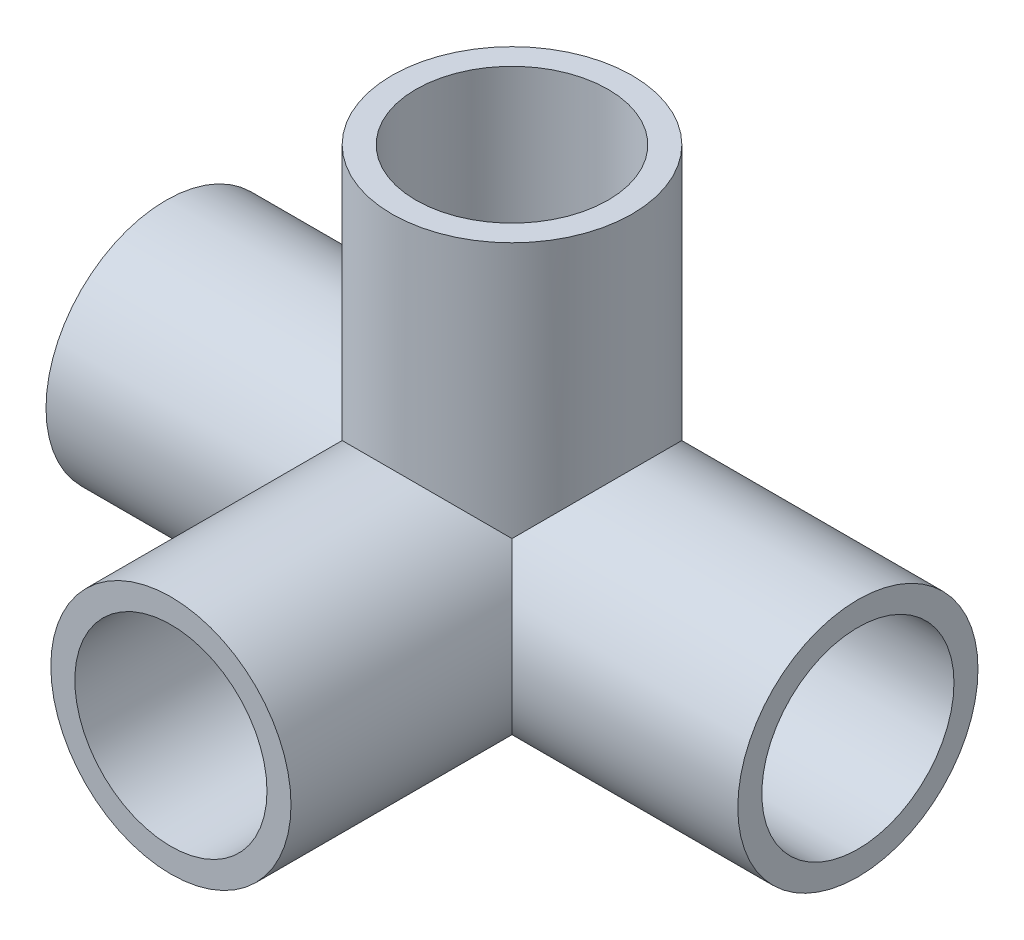
ISO-10303-21;
HEADER;
FILE_DESCRIPTION(('STEP AP214'),'2;1');
FILE_NAME('part.step','',(''),(''),'','','');
FILE_SCHEMA(('AUTOMOTIVE_DESIGN { 1 0 10303 214 1 1 1 1 }'));
ENDSEC;
DATA;
#1=APPLICATION_CONTEXT('core data for automotive mechanical design processes');
#2=APPLICATION_PROTOCOL_DEFINITION('international standard','automotive_design',2000,#1);
#3=PRODUCT_CONTEXT('',#1,'mechanical');
#4=PRODUCT('Part','Part','',(#3));
#5=PRODUCT_RELATED_PRODUCT_CATEGORY('part','',(#4));
#6=PRODUCT_DEFINITION_FORMATION('','',#4);
#7=PRODUCT_DEFINITION_CONTEXT('part definition',#1,'design');
#8=PRODUCT_DEFINITION('design','',#6,#7);
#9=PRODUCT_DEFINITION_SHAPE('','',#8);
#10=(LENGTH_UNIT() NAMED_UNIT(*) SI_UNIT(.MILLI.,.METRE.));
#11=(NAMED_UNIT(*) PLANE_ANGLE_UNIT() SI_UNIT($,.RADIAN.));
#12=(NAMED_UNIT(*) SI_UNIT($,.STERADIAN.) SOLID_ANGLE_UNIT());
#13=UNCERTAINTY_MEASURE_WITH_UNIT(LENGTH_MEASURE(1.E-05),#10,'distance_accuracy_value','');
#14=(GEOMETRIC_REPRESENTATION_CONTEXT(3) GLOBAL_UNCERTAINTY_ASSIGNED_CONTEXT((#13)) GLOBAL_UNIT_ASSIGNED_CONTEXT((#10,
#11,#12)) REPRESENTATION_CONTEXT('',''));
#15=CARTESIAN_POINT('',(0.,0.,0.));
#16=DIRECTION('',(0.,0.,1.));
#17=DIRECTION('',(1.,0.,0.));
#18=AXIS2_PLACEMENT_3D('',#15,#16,#17);
#19=CARTESIAN_POINT('',(36.,0.,0.));
#20=DIRECTION('',(-1.,0.,0.));
#21=DIRECTION('',(0.,0.,1.));
#22=AXIS2_PLACEMENT_3D('',#19,#20,#21);
#23=CYLINDRICAL_SURFACE('',#22,12.5);
#24=CARTESIAN_POINT('',(36.,0.,0.));
#25=DIRECTION('',(1.,0.,0.));
#26=DIRECTION('',(0.,0.,-1.));
#27=AXIS2_PLACEMENT_3D('',#24,#25,#26);
#28=CIRCLE('',#27,12.5);
#29=CARTESIAN_POINT('',(36.,0.,-12.5));
#30=VERTEX_POINT('',#29);
#31=EDGE_CURVE('E102',#30,#30,#28,.T.);
#32=ORIENTED_EDGE('',*,*,#31,.F.);
#33=EDGE_LOOP('',(#32));
#34=FACE_BOUND('',#33,.T.);
#35=CARTESIAN_POINT('',(-36.,0.,0.));
#36=DIRECTION('',(1.,0.,0.));
#37=DIRECTION('',(0.,0.,-1.));
#38=AXIS2_PLACEMENT_3D('',#35,#36,#37);
#39=CIRCLE('',#38,12.5);
#40=CARTESIAN_POINT('',(-36.,0.,-12.5));
#41=VERTEX_POINT('',#40);
#42=EDGE_CURVE('E106',#41,#41,#39,.T.);
#43=ORIENTED_EDGE('',*,*,#42,.T.);
#44=EDGE_LOOP('',(#43));
#45=FACE_BOUND('',#44,.T.);
#46=CARTESIAN_POINT('',(0.,0.,0.));
#47=DIRECTION('',(-0.707106781186547,0.,-0.707106781186547));
#48=DIRECTION('',(-0.707106781186547,0.,0.707106781186547));
#49=AXIS2_PLACEMENT_3D('',#46,#47,#48);
#50=ELLIPSE('',#49,17.6776695296637,12.5);
#51=CARTESIAN_POINT('',(-8.83883476483184,8.83883476483184,8.83883476483184));
#52=VERTEX_POINT('',#51);
#53=CARTESIAN_POINT('',(0.,-12.5,0.));
#54=VERTEX_POINT('',#53);
#55=EDGE_CURVE('E96',#52,#54,#50,.F.);
#56=ORIENTED_EDGE('',*,*,#55,.F.);
#57=CARTESIAN_POINT('',(0.,0.,0.));
#58=DIRECTION('',(-0.707106781186547,-0.707106781186547,0.));
#59=DIRECTION('',(-0.707106781186547,0.707106781186547,0.));
#60=AXIS2_PLACEMENT_3D('',#57,#58,#59);
#61=ELLIPSE('',#60,17.6776695296637,12.5);
#62=CARTESIAN_POINT('',(0.,0.,-12.5));
#63=VERTEX_POINT('',#62);
#64=EDGE_CURVE('E44',#63,#52,#61,.F.);
#65=ORIENTED_EDGE('',*,*,#64,.F.);
#66=CARTESIAN_POINT('',(0.,0.,0.));
#67=DIRECTION('',(-0.707106781186547,0.707106781186547,0.));
#68=DIRECTION('',(-0.707106781186547,-0.707106781186547,0.));
#69=AXIS2_PLACEMENT_3D('',#66,#67,#68);
#70=ELLIPSE('',#69,17.6776695296637,12.5);
#71=CARTESIAN_POINT('',(8.83883476483184,8.83883476483184,8.83883476483184));
#72=VERTEX_POINT('',#71);
#73=EDGE_CURVE('E100',#72,#63,#70,.T.);
#74=ORIENTED_EDGE('',*,*,#73,.F.);
#75=CARTESIAN_POINT('',(0.,0.,0.));
#76=DIRECTION('',(-0.707106781186547,0.,0.707106781186547));
#77=DIRECTION('',(-0.707106781186547,0.,-0.707106781186547));
#78=AXIS2_PLACEMENT_3D('',#75,#76,#77);
#79=ELLIPSE('',#78,17.6776695296637,12.5);
#80=EDGE_CURVE('E51',#54,#72,#79,.T.);
#81=ORIENTED_EDGE('',*,*,#80,.F.);
#82=EDGE_LOOP('',(#56,#65,#74,#81));
#83=FACE_BOUND('',#82,.T.);
#84=ADVANCED_FACE('F34',(#34,#45,#83),#23,.T.);
#85=CARTESIAN_POINT('',(0.,35.5,0.));
#86=DIRECTION('',(0.,-1.,0.));
#87=DIRECTION('',(0.,0.,-1.));
#88=AXIS2_PLACEMENT_3D('',#85,#86,#87);
#89=CYLINDRICAL_SURFACE('',#88,12.5);
#90=CARTESIAN_POINT('',(0.,35.5,0.));
#91=DIRECTION('',(0.,1.,0.));
#92=DIRECTION('',(0.,0.,1.));
#93=AXIS2_PLACEMENT_3D('',#90,#91,#92);
#94=CIRCLE('',#93,12.5);
#95=CARTESIAN_POINT('',(0.,35.5,12.5));
#96=VERTEX_POINT('',#95);
#97=EDGE_CURVE('E98',#96,#96,#94,.T.);
#98=ORIENTED_EDGE('',*,*,#97,.F.);
#99=EDGE_LOOP('',(#98));
#100=FACE_BOUND('',#99,.T.);
#101=CARTESIAN_POINT('',(0.,0.,0.));
#102=DIRECTION('',(0.,-0.707106781186547,0.707106781186547));
#103=DIRECTION('',(0.,-0.707106781186547,-0.707106781186547));
#104=AXIS2_PLACEMENT_3D('',#101,#102,#103);
#105=ELLIPSE('',#104,17.6776695296637,12.5);
#106=EDGE_CURVE('E11',#72,#52,#105,.T.);
#107=ORIENTED_EDGE('',*,*,#106,.F.);
#108=ORIENTED_EDGE('',*,*,#73,.T.);
#109=ORIENTED_EDGE('',*,*,#64,.T.);
#110=EDGE_LOOP('',(#107,#108,#109));
#111=FACE_BOUND('',#110,.T.);
#112=ADVANCED_FACE('F113',(#100,#111),#89,.T.);
#113=CARTESIAN_POINT('',(36.,0.,0.));
#114=DIRECTION('',(1.,0.,0.));
#115=DIRECTION('',(0.,0.,-1.));
#116=AXIS2_PLACEMENT_3D('',#113,#114,#115);
#117=PLANE('',#116);
#118=CARTESIAN_POINT('',(36.,0.,0.));
#119=DIRECTION('',(1.,0.,0.));
#120=DIRECTION('',(0.,0.,-1.));
#121=AXIS2_PLACEMENT_3D('',#118,#119,#120);
#122=CIRCLE('',#121,10.);
#123=CARTESIAN_POINT('',(36.,0.,-10.));
#124=VERTEX_POINT('',#123);
#125=EDGE_CURVE('E165',#124,#124,#122,.T.);
#126=ORIENTED_EDGE('',*,*,#125,.F.);
#127=EDGE_LOOP('',(#126));
#128=FACE_BOUND('',#127,.T.);
#129=ORIENTED_EDGE('',*,*,#31,.T.);
#130=EDGE_LOOP('',(#129));
#131=FACE_BOUND('',#130,.T.);
#132=ADVANCED_FACE('F116',(#128,#131),#117,.T.);
#133=CARTESIAN_POINT('',(-36.,0.,0.));
#134=DIRECTION('',(1.,0.,0.));
#135=DIRECTION('',(0.,0.,-1.));
#136=AXIS2_PLACEMENT_3D('',#133,#134,#135);
#137=PLANE('',#136);
#138=CARTESIAN_POINT('',(-36.,0.,0.));
#139=DIRECTION('',(1.,0.,0.));
#140=DIRECTION('',(0.,0.,-1.));
#141=AXIS2_PLACEMENT_3D('',#138,#139,#140);
#142=CIRCLE('',#141,10.);
#143=CARTESIAN_POINT('',(-36.,0.,-10.));
#144=VERTEX_POINT('',#143);
#145=EDGE_CURVE('E164',#144,#144,#142,.T.);
#146=ORIENTED_EDGE('',*,*,#145,.T.);
#147=EDGE_LOOP('',(#146));
#148=FACE_BOUND('',#147,.T.);
#149=ORIENTED_EDGE('',*,*,#42,.F.);
#150=EDGE_LOOP('',(#149));
#151=FACE_BOUND('',#150,.T.);
#152=ADVANCED_FACE('F128',(#148,#151),#137,.F.);
#153=CARTESIAN_POINT('',(0.,35.5,0.));
#154=DIRECTION('',(0.,1.,0.));
#155=DIRECTION('',(0.,0.,1.));
#156=AXIS2_PLACEMENT_3D('',#153,#154,#155);
#157=PLANE('',#156);
#158=CARTESIAN_POINT('',(0.,35.5,0.));
#159=DIRECTION('',(0.,1.,0.));
#160=DIRECTION('',(0.,0.,1.));
#161=AXIS2_PLACEMENT_3D('',#158,#159,#160);
#162=CIRCLE('',#161,10.);
#163=CARTESIAN_POINT('',(0.,35.5,10.));
#164=VERTEX_POINT('',#163);
#165=EDGE_CURVE('E89',#164,#164,#162,.T.);
#166=ORIENTED_EDGE('',*,*,#165,.F.);
#167=EDGE_LOOP('',(#166));
#168=FACE_BOUND('',#167,.T.);
#169=ORIENTED_EDGE('',*,*,#97,.T.);
#170=EDGE_LOOP('',(#169));
#171=FACE_BOUND('',#170,.T.);
#172=ADVANCED_FACE('F111',(#168,#171),#157,.T.);
#173=CARTESIAN_POINT('',(0.,0.,35.5));
#174=DIRECTION('',(0.,0.,-1.));
#175=DIRECTION('',(-1.,0.,0.));
#176=AXIS2_PLACEMENT_3D('',#173,#174,#175);
#177=CYLINDRICAL_SURFACE('',#176,12.5);
#178=CARTESIAN_POINT('',(0.,0.,35.5));
#179=DIRECTION('',(0.,0.,1.));
#180=DIRECTION('',(1.,0.,0.));
#181=AXIS2_PLACEMENT_3D('',#178,#179,#180);
#182=CIRCLE('',#181,12.5);
#183=CARTESIAN_POINT('',(12.5,0.,35.5));
#184=VERTEX_POINT('',#183);
#185=EDGE_CURVE('E38',#184,#184,#182,.T.);
#186=ORIENTED_EDGE('',*,*,#185,.F.);
#187=EDGE_LOOP('',(#186));
#188=FACE_BOUND('',#187,.T.);
#189=ORIENTED_EDGE('',*,*,#106,.T.);
#190=ORIENTED_EDGE('',*,*,#55,.T.);
#191=ORIENTED_EDGE('',*,*,#80,.T.);
#192=EDGE_LOOP('',(#189,#190,#191));
#193=FACE_BOUND('',#192,.T.);
#194=ADVANCED_FACE('F36',(#188,#193),#177,.T.);
#195=CARTESIAN_POINT('',(0.,0.,35.5));
#196=DIRECTION('',(0.,0.,1.));
#197=DIRECTION('',(1.,0.,0.));
#198=AXIS2_PLACEMENT_3D('',#195,#196,#197);
#199=PLANE('',#198);
#200=CARTESIAN_POINT('',(0.,0.,35.5));
#201=DIRECTION('',(0.,0.,1.));
#202=DIRECTION('',(1.,0.,0.));
#203=AXIS2_PLACEMENT_3D('',#200,#201,#202);
#204=CIRCLE('',#203,10.);
#205=CARTESIAN_POINT('',(10.,0.,35.5));
#206=VERTEX_POINT('',#205);
#207=EDGE_CURVE('E158',#206,#206,#204,.T.);
#208=ORIENTED_EDGE('',*,*,#207,.F.);
#209=EDGE_LOOP('',(#208));
#210=FACE_BOUND('',#209,.T.);
#211=ORIENTED_EDGE('',*,*,#185,.T.);
#212=EDGE_LOOP('',(#211));
#213=FACE_BOUND('',#212,.T.);
#214=ADVANCED_FACE('F120',(#210,#213),#199,.T.);
#215=CARTESIAN_POINT('',(36.,0.,0.));
#216=DIRECTION('',(-1.,0.,0.));
#217=DIRECTION('',(0.,0.,1.));
#218=AXIS2_PLACEMENT_3D('',#215,#216,#217);
#219=CYLINDRICAL_SURFACE('',#218,10.);
#220=ORIENTED_EDGE('',*,*,#125,.T.);
#221=EDGE_LOOP('',(#220));
#222=FACE_BOUND('',#221,.T.);
#223=ORIENTED_EDGE('',*,*,#145,.F.);
#224=EDGE_LOOP('',(#223));
#225=FACE_BOUND('',#224,.T.);
#226=CARTESIAN_POINT('',(0.,0.,0.));
#227=DIRECTION('',(-0.707106781186547,0.,-0.707106781186547));
#228=DIRECTION('',(-0.707106781186547,0.,0.707106781186547));
#229=AXIS2_PLACEMENT_3D('',#226,#227,#228);
#230=ELLIPSE('',#229,14.1421356237309,10.);
#231=CARTESIAN_POINT('',(-7.07106781186547,7.07106781186547,7.07106781186547));
#232=VERTEX_POINT('',#231);
#233=CARTESIAN_POINT('',(0.,-10.,0.));
#234=VERTEX_POINT('',#233);
#235=EDGE_CURVE('E79',#232,#234,#230,.F.);
#236=ORIENTED_EDGE('',*,*,#235,.T.);
#237=CARTESIAN_POINT('',(0.,0.,0.));
#238=DIRECTION('',(-0.707106781186547,0.,0.707106781186547));
#239=DIRECTION('',(-0.707106781186547,0.,-0.707106781186547));
#240=AXIS2_PLACEMENT_3D('',#237,#238,#239);
#241=ELLIPSE('',#240,14.1421356237309,10.);
#242=CARTESIAN_POINT('',(7.07106781186547,7.07106781186547,7.07106781186547));
#243=VERTEX_POINT('',#242);
#244=EDGE_CURVE('E88',#234,#243,#241,.T.);
#245=ORIENTED_EDGE('',*,*,#244,.T.);
#246=CARTESIAN_POINT('',(0.,0.,0.));
#247=DIRECTION('',(-0.707106781186547,0.707106781186547,0.));
#248=DIRECTION('',(-0.707106781186547,-0.707106781186547,0.));
#249=AXIS2_PLACEMENT_3D('',#246,#247,#248);
#250=ELLIPSE('',#249,14.1421356237309,10.);
#251=CARTESIAN_POINT('',(0.,0.,-10.));
#252=VERTEX_POINT('',#251);
#253=EDGE_CURVE('E81',#243,#252,#250,.T.);
#254=ORIENTED_EDGE('',*,*,#253,.T.);
#255=CARTESIAN_POINT('',(0.,0.,0.));
#256=DIRECTION('',(-0.707106781186547,-0.707106781186547,0.));
#257=DIRECTION('',(-0.707106781186547,0.707106781186547,0.));
#258=AXIS2_PLACEMENT_3D('',#255,#256,#257);
#259=ELLIPSE('',#258,14.1421356237309,10.);
#260=EDGE_CURVE('E75',#252,#232,#259,.F.);
#261=ORIENTED_EDGE('',*,*,#260,.T.);
#262=EDGE_LOOP('',(#236,#245,#254,#261));
#263=FACE_BOUND('',#262,.T.);
#264=ADVANCED_FACE('F77',(#222,#225,#263),#219,.F.);
#265=CARTESIAN_POINT('',(0.,35.5,0.));
#266=DIRECTION('',(0.,-1.,0.));
#267=DIRECTION('',(0.,0.,-1.));
#268=AXIS2_PLACEMENT_3D('',#265,#266,#267);
#269=CYLINDRICAL_SURFACE('',#268,10.);
#270=ORIENTED_EDGE('',*,*,#165,.T.);
#271=EDGE_LOOP('',(#270));
#272=FACE_BOUND('',#271,.T.);
#273=CARTESIAN_POINT('',(0.,0.,0.));
#274=DIRECTION('',(0.,-0.707106781186547,0.707106781186547));
#275=DIRECTION('',(0.,-0.707106781186547,-0.707106781186547));
#276=AXIS2_PLACEMENT_3D('',#273,#274,#275);
#277=ELLIPSE('',#276,14.1421356237309,10.);
#278=EDGE_CURVE('E84',#243,#232,#277,.T.);
#279=ORIENTED_EDGE('',*,*,#278,.T.);
#280=ORIENTED_EDGE('',*,*,#260,.F.);
#281=ORIENTED_EDGE('',*,*,#253,.F.);
#282=EDGE_LOOP('',(#279,#280,#281));
#283=FACE_BOUND('',#282,.T.);
#284=ADVANCED_FACE('F91',(#272,#283),#269,.F.);
#285=CARTESIAN_POINT('',(0.,0.,35.5));
#286=DIRECTION('',(0.,0.,-1.));
#287=DIRECTION('',(-1.,0.,0.));
#288=AXIS2_PLACEMENT_3D('',#285,#286,#287);
#289=CYLINDRICAL_SURFACE('',#288,10.);
#290=ORIENTED_EDGE('',*,*,#207,.T.);
#291=EDGE_LOOP('',(#290));
#292=FACE_BOUND('',#291,.T.);
#293=ORIENTED_EDGE('',*,*,#278,.F.);
#294=ORIENTED_EDGE('',*,*,#244,.F.);
#295=ORIENTED_EDGE('',*,*,#235,.F.);
#296=EDGE_LOOP('',(#293,#294,#295));
#297=FACE_BOUND('',#296,.T.);
#298=ADVANCED_FACE('F87',(#292,#297),#289,.F.);
#299=CLOSED_SHELL('',(#84,#112,#132,#152,#172,#194,#214,#264,#284,#298));
#300=MANIFOLD_SOLID_BREP('B2',#299);
#301=ADVANCED_BREP_SHAPE_REPRESENTATION('',(#18,#300),#14);
#302=SHAPE_DEFINITION_REPRESENTATION(#9,#301);
ENDSEC;
END-ISO-10303-21;
